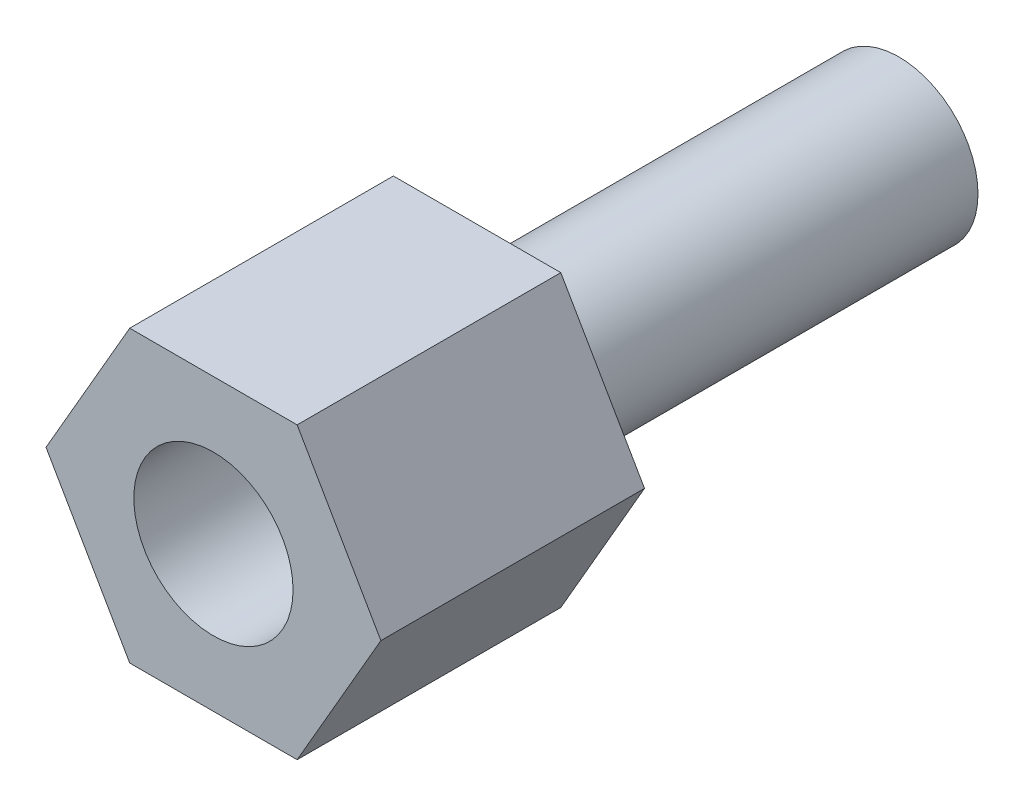
ISO-10303-21;
HEADER;
FILE_DESCRIPTION(('STEP AP214'),'2;1');
FILE_NAME('part.step','',(''),(''),'','','');
FILE_SCHEMA(('AUTOMOTIVE_DESIGN { 1 0 10303 214 1 1 1 1 }'));
ENDSEC;
DATA;
#1=APPLICATION_CONTEXT('core data for automotive mechanical design processes');
#2=APPLICATION_PROTOCOL_DEFINITION('international standard','automotive_design',2000,#1);
#3=PRODUCT_CONTEXT('',#1,'mechanical');
#4=PRODUCT('Part','Part','',(#3));
#5=PRODUCT_RELATED_PRODUCT_CATEGORY('part','',(#4));
#6=PRODUCT_DEFINITION_FORMATION('','',#4);
#7=PRODUCT_DEFINITION_CONTEXT('part definition',#1,'design');
#8=PRODUCT_DEFINITION('design','',#6,#7);
#9=PRODUCT_DEFINITION_SHAPE('','',#8);
#10=(LENGTH_UNIT() NAMED_UNIT(*) SI_UNIT(.MILLI.,.METRE.));
#11=(NAMED_UNIT(*) PLANE_ANGLE_UNIT() SI_UNIT($,.RADIAN.));
#12=(NAMED_UNIT(*) SI_UNIT($,.STERADIAN.) SOLID_ANGLE_UNIT());
#13=UNCERTAINTY_MEASURE_WITH_UNIT(LENGTH_MEASURE(1.E-05),#10,'distance_accuracy_value','');
#14=(GEOMETRIC_REPRESENTATION_CONTEXT(3) GLOBAL_UNCERTAINTY_ASSIGNED_CONTEXT((#13)) GLOBAL_UNIT_ASSIGNED_CONTEXT((#10,
#11,#12)) REPRESENTATION_CONTEXT('',''));
#15=CARTESIAN_POINT('',(0.,0.,0.));
#16=DIRECTION('',(0.,0.,1.));
#17=DIRECTION('',(1.,0.,0.));
#18=AXIS2_PLACEMENT_3D('',#15,#16,#17);
#19=CARTESIAN_POINT('',(0.,0.,5.));
#20=DIRECTION('',(0.,0.,1.));
#21=DIRECTION('',(1.,0.,0.));
#22=AXIS2_PLACEMENT_3D('',#19,#20,#21);
#23=PLANE('',#22);
#24=DIRECTION('',(0.5,0.866025403784439,0.));
#25=VECTOR('',#24,1.);
#26=CARTESIAN_POINT('',(1.58771324027147,-2.75,5.));
#27=LINE('',#26,#25);
#28=CARTESIAN_POINT('',(1.58771324027147,-2.75,5.));
#29=VERTEX_POINT('',#28);
#30=CARTESIAN_POINT('',(3.17542648054294,0.,5.));
#31=VERTEX_POINT('',#30);
#32=EDGE_CURVE('E145',#29,#31,#27,.T.);
#33=ORIENTED_EDGE('',*,*,#32,.T.);
#34=DIRECTION('',(-0.5,0.866025403784439,0.));
#35=VECTOR('',#34,1.);
#36=CARTESIAN_POINT('',(3.17542648054294,0.,5.));
#37=LINE('',#36,#35);
#38=CARTESIAN_POINT('',(1.58771324027147,2.75,5.));
#39=VERTEX_POINT('',#38);
#40=EDGE_CURVE('E105',#31,#39,#37,.T.);
#41=ORIENTED_EDGE('',*,*,#40,.T.);
#42=DIRECTION('',(-1.,0.,0.));
#43=VECTOR('',#42,1.);
#44=CARTESIAN_POINT('',(1.58771324027147,2.75,5.));
#45=LINE('',#44,#43);
#46=CARTESIAN_POINT('',(-1.58771324027147,2.75,5.));
#47=VERTEX_POINT('',#46);
#48=EDGE_CURVE('E113',#39,#47,#45,.T.);
#49=ORIENTED_EDGE('',*,*,#48,.T.);
#50=DIRECTION('',(-0.5,-0.866025403784438,0.));
#51=VECTOR('',#50,1.);
#52=CARTESIAN_POINT('',(-1.58771324027147,2.75,5.));
#53=LINE('',#52,#51);
#54=CARTESIAN_POINT('',(-3.17542648054294,0.,5.));
#55=VERTEX_POINT('',#54);
#56=EDGE_CURVE('E108',#47,#55,#53,.T.);
#57=ORIENTED_EDGE('',*,*,#56,.T.);
#58=DIRECTION('',(0.5,-0.866025403784439,0.));
#59=VECTOR('',#58,1.);
#60=CARTESIAN_POINT('',(-3.17542648054294,0.,5.));
#61=LINE('',#60,#59);
#62=CARTESIAN_POINT('',(-1.58771324027147,-2.75,5.));
#63=VERTEX_POINT('',#62);
#64=EDGE_CURVE('E114',#55,#63,#61,.T.);
#65=ORIENTED_EDGE('',*,*,#64,.T.);
#66=DIRECTION('',(1.,0.,0.));
#67=VECTOR('',#66,1.);
#68=CARTESIAN_POINT('',(-1.58771324027147,-2.75,5.));
#69=LINE('',#68,#67);
#70=EDGE_CURVE('E64',#63,#29,#69,.T.);
#71=ORIENTED_EDGE('',*,*,#70,.T.);
#72=EDGE_LOOP('',(#33,#41,#49,#57,#65,#71));
#73=FACE_BOUND('',#72,.T.);
#74=CARTESIAN_POINT('',(0.,0.,5.));
#75=DIRECTION('',(0.,0.,1.));
#76=DIRECTION('',(1.,0.,0.));
#77=AXIS2_PLACEMENT_3D('',#74,#75,#76);
#78=CIRCLE('',#77,1.51);
#79=CARTESIAN_POINT('',(1.51,0.,5.));
#80=VERTEX_POINT('',#79);
#81=EDGE_CURVE('E139',#80,#80,#78,.T.);
#82=ORIENTED_EDGE('',*,*,#81,.F.);
#83=EDGE_LOOP('',(#82));
#84=FACE_BOUND('',#83,.T.);
#85=ADVANCED_FACE('F50',(#73,#84),#23,.T.);
#86=CARTESIAN_POINT('',(0.,0.,0.));
#87=DIRECTION('',(0.,0.,1.));
#88=DIRECTION('',(1.,0.,0.));
#89=AXIS2_PLACEMENT_3D('',#86,#87,#88);
#90=PLANE('',#89);
#91=CARTESIAN_POINT('',(0.,0.,0.));
#92=DIRECTION('',(0.,0.,1.));
#93=DIRECTION('',(1.,0.,0.));
#94=AXIS2_PLACEMENT_3D('',#91,#92,#93);
#95=CIRCLE('',#94,1.5);
#96=CARTESIAN_POINT('',(1.5,0.,0.));
#97=VERTEX_POINT('',#96);
#98=EDGE_CURVE('E164',#97,#97,#95,.T.);
#99=ORIENTED_EDGE('',*,*,#98,.T.);
#100=EDGE_LOOP('',(#99));
#101=FACE_BOUND('',#100,.T.);
#102=DIRECTION('',(0.5,0.866025403784439,0.));
#103=VECTOR('',#102,1.);
#104=CARTESIAN_POINT('',(1.58771324027147,-2.75,0.));
#105=LINE('',#104,#103);
#106=CARTESIAN_POINT('',(1.58771324027147,-2.75,0.));
#107=VERTEX_POINT('',#106);
#108=CARTESIAN_POINT('',(3.17542648054294,0.,0.));
#109=VERTEX_POINT('',#108);
#110=EDGE_CURVE('E131',#107,#109,#105,.T.);
#111=ORIENTED_EDGE('',*,*,#110,.F.);
#112=DIRECTION('',(1.,0.,0.));
#113=VECTOR('',#112,1.);
#114=CARTESIAN_POINT('',(-1.58771324027147,-2.75,0.));
#115=LINE('',#114,#113);
#116=CARTESIAN_POINT('',(-1.58771324027147,-2.75,0.));
#117=VERTEX_POINT('',#116);
#118=EDGE_CURVE('E91',#117,#107,#115,.T.);
#119=ORIENTED_EDGE('',*,*,#118,.F.);
#120=DIRECTION('',(0.5,-0.866025403784439,0.));
#121=VECTOR('',#120,1.);
#122=CARTESIAN_POINT('',(-3.17542648054294,0.,0.));
#123=LINE('',#122,#121);
#124=CARTESIAN_POINT('',(-3.17542648054294,0.,0.));
#125=VERTEX_POINT('',#124);
#126=EDGE_CURVE('E87',#125,#117,#123,.T.);
#127=ORIENTED_EDGE('',*,*,#126,.F.);
#128=DIRECTION('',(-0.5,-0.866025403784438,0.));
#129=VECTOR('',#128,1.);
#130=CARTESIAN_POINT('',(-1.58771324027147,2.75,0.));
#131=LINE('',#130,#129);
#132=CARTESIAN_POINT('',(-1.58771324027147,2.75,0.));
#133=VERTEX_POINT('',#132);
#134=EDGE_CURVE('E125',#133,#125,#131,.T.);
#135=ORIENTED_EDGE('',*,*,#134,.F.);
#136=DIRECTION('',(-1.,0.,0.));
#137=VECTOR('',#136,1.);
#138=CARTESIAN_POINT('',(1.58771324027147,2.75,0.));
#139=LINE('',#138,#137);
#140=CARTESIAN_POINT('',(1.58771324027147,2.75,0.));
#141=VERTEX_POINT('',#140);
#142=EDGE_CURVE('E136',#141,#133,#139,.T.);
#143=ORIENTED_EDGE('',*,*,#142,.F.);
#144=DIRECTION('',(-0.5,0.866025403784439,0.));
#145=VECTOR('',#144,1.);
#146=CARTESIAN_POINT('',(3.17542648054294,0.,0.));
#147=LINE('',#146,#145);
#148=EDGE_CURVE('E137',#109,#141,#147,.T.);
#149=ORIENTED_EDGE('',*,*,#148,.F.);
#150=EDGE_LOOP('',(#111,#119,#127,#135,#143,#149));
#151=FACE_BOUND('',#150,.T.);
#152=ADVANCED_FACE('F156',(#101,#151),#90,.F.);
#153=CARTESIAN_POINT('',(1.58771324027147,-2.75,5.));
#154=DIRECTION('',(-0.866025403784439,0.5,0.));
#155=DIRECTION('',(-0.5,-0.866025403784439,0.));
#156=AXIS2_PLACEMENT_3D('',#153,#154,#155);
#157=PLANE('',#156);
#158=ORIENTED_EDGE('',*,*,#110,.T.);
#159=DIRECTION('',(0.,0.,-1.));
#160=VECTOR('',#159,1.);
#161=CARTESIAN_POINT('',(3.17542648054294,0.,5.));
#162=LINE('',#161,#160);
#163=EDGE_CURVE('E57',#31,#109,#162,.T.);
#164=ORIENTED_EDGE('',*,*,#163,.F.);
#165=ORIENTED_EDGE('',*,*,#32,.F.);
#166=DIRECTION('',(0.,0.,-1.));
#167=VECTOR('',#166,1.);
#168=CARTESIAN_POINT('',(1.58771324027147,-2.75,5.));
#169=LINE('',#168,#167);
#170=EDGE_CURVE('E129',#29,#107,#169,.T.);
#171=ORIENTED_EDGE('',*,*,#170,.T.);
#172=EDGE_LOOP('',(#158,#164,#165,#171));
#173=FACE_BOUND('',#172,.T.);
#174=ADVANCED_FACE('F47',(#173),#157,.F.);
#175=CARTESIAN_POINT('',(3.17542648054294,0.,5.));
#176=DIRECTION('',(-0.866025403784439,-0.5,0.));
#177=DIRECTION('',(0.5,-0.866025403784439,0.));
#178=AXIS2_PLACEMENT_3D('',#175,#176,#177);
#179=PLANE('',#178);
#180=ORIENTED_EDGE('',*,*,#148,.T.);
#181=DIRECTION('',(0.,0.,-1.));
#182=VECTOR('',#181,1.);
#183=CARTESIAN_POINT('',(1.58771324027147,2.75,5.));
#184=LINE('',#183,#182);
#185=EDGE_CURVE('E146',#39,#141,#184,.T.);
#186=ORIENTED_EDGE('',*,*,#185,.F.);
#187=ORIENTED_EDGE('',*,*,#40,.F.);
#188=ORIENTED_EDGE('',*,*,#163,.T.);
#189=EDGE_LOOP('',(#180,#186,#187,#188));
#190=FACE_BOUND('',#189,.T.);
#191=ADVANCED_FACE('F151',(#190),#179,.F.);
#192=CARTESIAN_POINT('',(1.58771324027147,2.75,5.));
#193=DIRECTION('',(0.,-1.,0.));
#194=DIRECTION('',(1.,0.,0.));
#195=AXIS2_PLACEMENT_3D('',#192,#193,#194);
#196=PLANE('',#195);
#197=ORIENTED_EDGE('',*,*,#142,.T.);
#198=DIRECTION('',(0.,0.,-1.));
#199=VECTOR('',#198,1.);
#200=CARTESIAN_POINT('',(-1.58771324027147,2.75,5.));
#201=LINE('',#200,#199);
#202=EDGE_CURVE('E121',#47,#133,#201,.T.);
#203=ORIENTED_EDGE('',*,*,#202,.F.);
#204=ORIENTED_EDGE('',*,*,#48,.F.);
#205=ORIENTED_EDGE('',*,*,#185,.T.);
#206=EDGE_LOOP('',(#197,#203,#204,#205));
#207=FACE_BOUND('',#206,.T.);
#208=ADVANCED_FACE('F157',(#207),#196,.F.);
#209=CARTESIAN_POINT('',(-1.58771324027147,2.75,5.));
#210=DIRECTION('',(0.866025403784439,-0.5,0.));
#211=DIRECTION('',(0.5,0.866025403784439,0.));
#212=AXIS2_PLACEMENT_3D('',#209,#210,#211);
#213=PLANE('',#212);
#214=ORIENTED_EDGE('',*,*,#134,.T.);
#215=DIRECTION('',(0.,0.,-1.));
#216=VECTOR('',#215,1.);
#217=CARTESIAN_POINT('',(-3.17542648054294,0.,5.));
#218=LINE('',#217,#216);
#219=EDGE_CURVE('E117',#55,#125,#218,.T.);
#220=ORIENTED_EDGE('',*,*,#219,.F.);
#221=ORIENTED_EDGE('',*,*,#56,.F.);
#222=ORIENTED_EDGE('',*,*,#202,.T.);
#223=EDGE_LOOP('',(#214,#220,#221,#222));
#224=FACE_BOUND('',#223,.T.);
#225=ADVANCED_FACE('F122',(#224),#213,.F.);
#226=CARTESIAN_POINT('',(-3.17542648054294,0.,5.));
#227=DIRECTION('',(0.866025403784439,0.5,0.));
#228=DIRECTION('',(-0.5,0.866025403784439,0.));
#229=AXIS2_PLACEMENT_3D('',#226,#227,#228);
#230=PLANE('',#229);
#231=ORIENTED_EDGE('',*,*,#126,.T.);
#232=DIRECTION('',(0.,0.,-1.));
#233=VECTOR('',#232,1.);
#234=CARTESIAN_POINT('',(-1.58771324027147,-2.75,5.));
#235=LINE('',#234,#233);
#236=EDGE_CURVE('E123',#63,#117,#235,.T.);
#237=ORIENTED_EDGE('',*,*,#236,.F.);
#238=ORIENTED_EDGE('',*,*,#64,.F.);
#239=ORIENTED_EDGE('',*,*,#219,.T.);
#240=EDGE_LOOP('',(#231,#237,#238,#239));
#241=FACE_BOUND('',#240,.T.);
#242=ADVANCED_FACE('F130',(#241),#230,.F.);
#243=CARTESIAN_POINT('',(-1.58771324027147,-2.75,5.));
#244=DIRECTION('',(0.,1.,0.));
#245=DIRECTION('',(-1.,0.,0.));
#246=AXIS2_PLACEMENT_3D('',#243,#244,#245);
#247=PLANE('',#246);
#248=ORIENTED_EDGE('',*,*,#118,.T.);
#249=ORIENTED_EDGE('',*,*,#170,.F.);
#250=ORIENTED_EDGE('',*,*,#70,.F.);
#251=ORIENTED_EDGE('',*,*,#236,.T.);
#252=EDGE_LOOP('',(#248,#249,#250,#251));
#253=FACE_BOUND('',#252,.T.);
#254=ADVANCED_FACE('F193',(#253),#247,.F.);
#255=CARTESIAN_POINT('',(0.,0.,5.));
#256=DIRECTION('',(0.,0.,-1.));
#257=DIRECTION('',(-1.,0.,0.));
#258=AXIS2_PLACEMENT_3D('',#255,#256,#257);
#259=CYLINDRICAL_SURFACE('',#258,1.51);
#260=CARTESIAN_POINT('',(0.,0.,0.45));
#261=DIRECTION('',(0.,0.,1.));
#262=DIRECTION('',(1.,0.,0.));
#263=AXIS2_PLACEMENT_3D('',#260,#261,#262);
#264=CIRCLE('',#263,1.51);
#265=CARTESIAN_POINT('',(1.51,0.,0.45));
#266=VERTEX_POINT('',#265);
#267=EDGE_CURVE('E11',#266,#266,#264,.T.);
#268=ORIENTED_EDGE('',*,*,#267,.F.);
#269=EDGE_LOOP('',(#268));
#270=FACE_BOUND('',#269,.T.);
#271=ORIENTED_EDGE('',*,*,#81,.T.);
#272=EDGE_LOOP('',(#271));
#273=FACE_BOUND('',#272,.T.);
#274=ADVANCED_FACE('F194',(#270,#273),#259,.F.);
#275=CARTESIAN_POINT('',(0.,0.,0.45));
#276=DIRECTION('',(0.,0.,1.));
#277=DIRECTION('',(1.,0.,0.));
#278=AXIS2_PLACEMENT_3D('',#275,#276,#277);
#279=PLANE('',#278);
#280=ORIENTED_EDGE('',*,*,#267,.T.);
#281=EDGE_LOOP('',(#280));
#282=FACE_BOUND('',#281,.T.);
#283=ADVANCED_FACE('F179',(#282),#279,.T.);
#284=CARTESIAN_POINT('',(0.,0.,0.));
#285=DIRECTION('',(0.,0.,-1.));
#286=DIRECTION('',(-1.,0.,0.));
#287=AXIS2_PLACEMENT_3D('',#284,#285,#286);
#288=CYLINDRICAL_SURFACE('',#287,1.5);
#289=ORIENTED_EDGE('',*,*,#98,.F.);
#290=EDGE_LOOP('',(#289));
#291=FACE_BOUND('',#290,.T.);
#292=CARTESIAN_POINT('',(0.,0.,-8.));
#293=DIRECTION('',(0.,0.,1.));
#294=DIRECTION('',(1.,0.,0.));
#295=AXIS2_PLACEMENT_3D('',#292,#293,#294);
#296=CIRCLE('',#295,1.5);
#297=CARTESIAN_POINT('',(1.5,0.,-8.));
#298=VERTEX_POINT('',#297);
#299=EDGE_CURVE('E167',#298,#298,#296,.T.);
#300=ORIENTED_EDGE('',*,*,#299,.T.);
#301=EDGE_LOOP('',(#300));
#302=FACE_BOUND('',#301,.T.);
#303=ADVANCED_FACE('F171',(#291,#302),#288,.T.);
#304=CARTESIAN_POINT('',(0.,0.,-8.));
#305=DIRECTION('',(0.,0.,1.));
#306=DIRECTION('',(1.,0.,0.));
#307=AXIS2_PLACEMENT_3D('',#304,#305,#306);
#308=PLANE('',#307);
#309=ORIENTED_EDGE('',*,*,#299,.F.);
#310=EDGE_LOOP('',(#309));
#311=FACE_BOUND('',#310,.T.);
#312=ADVANCED_FACE('F177',(#311),#308,.F.);
#313=CLOSED_SHELL('',(#85,#152,#174,#191,#208,#225,#242,#254,#274,#283,#303,#312));
#314=MANIFOLD_SOLID_BREP('B2',#313);
#315=ADVANCED_BREP_SHAPE_REPRESENTATION('',(#18,#314),#14);
#316=SHAPE_DEFINITION_REPRESENTATION(#9,#315);
ENDSEC;
END-ISO-10303-21;
